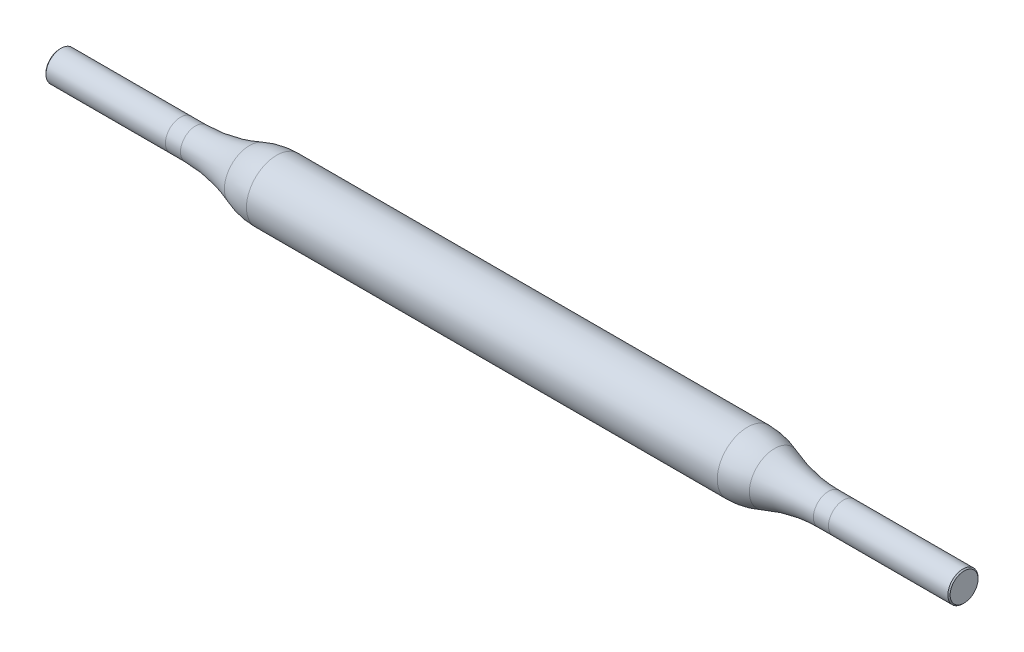
ISO-10303-21;
HEADER;
FILE_DESCRIPTION(('STEP AP214'),'2;1');
FILE_NAME('part.step','',(''),(''),'','','');
FILE_SCHEMA(('AUTOMOTIVE_DESIGN { 1 0 10303 214 1 1 1 1 }'));
ENDSEC;
DATA;
#1=APPLICATION_CONTEXT('core data for automotive mechanical design processes');
#2=APPLICATION_PROTOCOL_DEFINITION('international standard','automotive_design',2000,#1);
#3=PRODUCT_CONTEXT('',#1,'mechanical');
#4=PRODUCT('Part','Part','',(#3));
#5=PRODUCT_RELATED_PRODUCT_CATEGORY('part','',(#4));
#6=PRODUCT_DEFINITION_FORMATION('','',#4);
#7=PRODUCT_DEFINITION_CONTEXT('part definition',#1,'design');
#8=PRODUCT_DEFINITION('design','',#6,#7);
#9=PRODUCT_DEFINITION_SHAPE('','',#8);
#10=(LENGTH_UNIT() NAMED_UNIT(*) SI_UNIT(.MILLI.,.METRE.));
#11=(NAMED_UNIT(*) PLANE_ANGLE_UNIT() SI_UNIT($,.RADIAN.));
#12=(NAMED_UNIT(*) SI_UNIT($,.STERADIAN.) SOLID_ANGLE_UNIT());
#13=UNCERTAINTY_MEASURE_WITH_UNIT(LENGTH_MEASURE(1.E-05),#10,'distance_accuracy_value','');
#14=(GEOMETRIC_REPRESENTATION_CONTEXT(3) GLOBAL_UNCERTAINTY_ASSIGNED_CONTEXT((#13)) GLOBAL_UNIT_ASSIGNED_CONTEXT((#10,
#11,#12)) REPRESENTATION_CONTEXT('',''));
#15=CARTESIAN_POINT('',(0.,0.,0.));
#16=DIRECTION('',(0.,0.,1.));
#17=DIRECTION('',(1.,0.,0.));
#18=AXIS2_PLACEMENT_3D('',#15,#16,#17);
#19=CARTESIAN_POINT('',(-30.,0.,0.));
#20=DIRECTION('',(-1.,0.,0.));
#21=DIRECTION('',(0.,0.,1.));
#22=AXIS2_PLACEMENT_3D('',#19,#20,#21);
#23=CYLINDRICAL_SURFACE('',#22,1.);
#24=CARTESIAN_POINT('',(-29.925,0.,0.));
#25=DIRECTION('',(1.,0.,0.));
#26=DIRECTION('',(0.,0.,-1.));
#27=AXIS2_PLACEMENT_3D('',#24,#25,#26);
#28=CIRCLE('',#27,1.);
#29=CARTESIAN_POINT('',(-29.925,0.,-1.));
#30=VERTEX_POINT('',#29);
#31=EDGE_CURVE('E57',#30,#30,#28,.T.);
#32=ORIENTED_EDGE('',*,*,#31,.T.);
#33=EDGE_LOOP('',(#32));
#34=FACE_BOUND('',#33,.T.);
#35=CARTESIAN_POINT('',(-22.,0.,0.));
#36=DIRECTION('',(1.,0.,0.));
#37=DIRECTION('',(0.,0.,-1.));
#38=AXIS2_PLACEMENT_3D('',#35,#36,#37);
#39=CIRCLE('',#38,1.);
#40=CARTESIAN_POINT('',(-22.,0.,-1.));
#41=VERTEX_POINT('',#40);
#42=EDGE_CURVE('E66',#41,#41,#39,.T.);
#43=ORIENTED_EDGE('',*,*,#42,.F.);
#44=EDGE_LOOP('',(#43));
#45=FACE_BOUND('',#44,.T.);
#46=ADVANCED_FACE('F45',(#34,#45),#23,.T.);
#47=CARTESIAN_POINT('',(-30.,0.,0.));
#48=DIRECTION('',(-1.,0.,0.));
#49=DIRECTION('',(0.,0.,1.));
#50=AXIS2_PLACEMENT_3D('',#47,#48,#49);
#51=CYLINDRICAL_SURFACE('',#50,1.);
#52=CARTESIAN_POINT('',(21.,0.,0.));
#53=DIRECTION('',(-1.,0.,0.));
#54=DIRECTION('',(0.,0.,1.));
#55=AXIS2_PLACEMENT_3D('',#52,#53,#54);
#56=CIRCLE('',#55,0.999999999999999);
#57=CARTESIAN_POINT('',(21.,0.,0.99999999999999));
#58=VERTEX_POINT('',#57);
#59=EDGE_CURVE('E74',#58,#58,#56,.T.);
#60=ORIENTED_EDGE('',*,*,#59,.F.);
#61=EDGE_LOOP('',(#60));
#62=FACE_BOUND('',#61,.T.);
#63=CARTESIAN_POINT('',(22.,0.,0.));
#64=DIRECTION('',(1.,0.,0.));
#65=DIRECTION('',(0.,0.,-1.));
#66=AXIS2_PLACEMENT_3D('',#63,#64,#65);
#67=CIRCLE('',#66,1.);
#68=CARTESIAN_POINT('',(22.,0.,-1.00000000000001));
#69=VERTEX_POINT('',#68);
#70=EDGE_CURVE('E70',#69,#69,#67,.T.);
#71=ORIENTED_EDGE('',*,*,#70,.F.);
#72=EDGE_LOOP('',(#71));
#73=FACE_BOUND('',#72,.T.);
#74=ADVANCED_FACE('F126',(#62,#73),#51,.T.);
#75=CARTESIAN_POINT('',(-30.,0.,0.));
#76=DIRECTION('',(1.,0.,0.));
#77=DIRECTION('',(0.,0.,-1.));
#78=AXIS2_PLACEMENT_3D('',#75,#76,#77);
#79=PLANE('',#78);
#80=CARTESIAN_POINT('',(-30.,0.,0.));
#81=DIRECTION('',(1.,0.,0.));
#82=DIRECTION('',(0.,0.,-1.));
#83=AXIS2_PLACEMENT_3D('',#80,#81,#82);
#84=CIRCLE('',#83,0.925000000000016);
#85=CARTESIAN_POINT('',(-30.,0.,-0.925000000000016));
#86=VERTEX_POINT('',#85);
#87=EDGE_CURVE('E61',#86,#86,#84,.F.);
#88=ORIENTED_EDGE('',*,*,#87,.T.);
#89=EDGE_LOOP('',(#88));
#90=FACE_BOUND('',#89,.T.);
#91=ADVANCED_FACE('F129',(#90),#79,.F.);
#92=CARTESIAN_POINT('',(30.,0.,0.));
#93=DIRECTION('',(-1.,0.,0.));
#94=DIRECTION('',(0.,0.,1.));
#95=AXIS2_PLACEMENT_3D('',#92,#93,#94);
#96=PLANE('',#95);
#97=CARTESIAN_POINT('',(30.,0.,0.));
#98=DIRECTION('',(-1.,0.,0.));
#99=DIRECTION('',(0.,0.,1.));
#100=AXIS2_PLACEMENT_3D('',#97,#98,#99);
#101=CIRCLE('',#100,0.925000000000016);
#102=CARTESIAN_POINT('',(30.,0.,0.925000000000005));
#103=VERTEX_POINT('',#102);
#104=EDGE_CURVE('E10',#103,#103,#101,.F.);
#105=ORIENTED_EDGE('',*,*,#104,.T.);
#106=EDGE_LOOP('',(#105));
#107=FACE_BOUND('',#106,.T.);
#108=ADVANCED_FACE('F134',(#107),#96,.F.);
#109=CARTESIAN_POINT('',(29.925,0.,0.));
#110=DIRECTION('',(-1.,0.,0.));
#111=DIRECTION('',(0.,0.,1.));
#112=AXIS2_PLACEMENT_3D('',#109,#110,#111);
#113=CIRCLE('',#112,1.);
#114=CARTESIAN_POINT('',(29.925,0.,0.999999999999989));
#115=VERTEX_POINT('',#114);
#116=EDGE_CURVE('E53',#115,#115,#113,.T.);
#117=ORIENTED_EDGE('',*,*,#116,.T.);
#118=EDGE_LOOP('',(#117));
#119=FACE_BOUND('',#118,.T.);
#120=ORIENTED_EDGE('',*,*,#70,.T.);
#121=EDGE_LOOP('',(#120));
#122=FACE_BOUND('',#121,.T.);
#123=ADVANCED_FACE('F122',(#119,#122),#51,.T.);
#124=CARTESIAN_POINT('',(21.,0.,0.));
#125=DIRECTION('',(-1.,0.,0.));
#126=DIRECTION('',(0.,0.,1.));
#127=AXIS2_PLACEMENT_3D('',#124,#125,#126);
#128=TOROIDAL_SURFACE('',#127,10.9626996656551,9.96269966565513);
#129=CARTESIAN_POINT('',(17.4189798790619,0.,0.));
#130=DIRECTION('',(-1.,0.,0.));
#131=DIRECTION('',(0.,0.,1.));
#132=AXIS2_PLACEMENT_3D('',#129,#130,#131);
#133=CIRCLE('',#132,1.66583570400221);
#134=CARTESIAN_POINT('',(17.4189798790619,0.,1.6658357040022));
#135=VERTEX_POINT('',#134);
#136=EDGE_CURVE('E77',#135,#135,#133,.T.);
#137=ORIENTED_EDGE('',*,*,#136,.F.);
#138=EDGE_LOOP('',(#137));
#139=FACE_BOUND('',#138,.T.);
#140=ORIENTED_EDGE('',*,*,#59,.T.);
#141=EDGE_LOOP('',(#140));
#142=FACE_BOUND('',#141,.T.);
#143=ADVANCED_FACE('F116',(#139,#142),#128,.F.);
#144=CARTESIAN_POINT('',(15.6217661512993,0.,0.));
#145=DIRECTION('',(-1.,0.,0.));
#146=DIRECTION('',(0.,0.,1.));
#147=AXIS2_PLACEMENT_3D('',#144,#145,#146);
#148=DEGENERATE_TOROIDAL_SURFACE('',#147,3.00000000000001,5.,.F.);
#149=CARTESIAN_POINT('',(15.6217661512993,0.,0.));
#150=DIRECTION('',(-1.,0.,0.));
#151=DIRECTION('',(0.,0.,1.));
#152=AXIS2_PLACEMENT_3D('',#149,#150,#151);
#153=CIRCLE('',#152,1.99999999999999);
#154=CARTESIAN_POINT('',(15.6217661512993,0.,1.99999999999998));
#155=VERTEX_POINT('',#154);
#156=EDGE_CURVE('E80',#155,#155,#153,.T.);
#157=ORIENTED_EDGE('',*,*,#156,.F.);
#158=EDGE_LOOP('',(#157));
#159=FACE_BOUND('',#158,.T.);
#160=ORIENTED_EDGE('',*,*,#136,.T.);
#161=EDGE_LOOP('',(#160));
#162=FACE_BOUND('',#161,.T.);
#163=ADVANCED_FACE('F110',(#159,#162),#148,.F.);
#164=CARTESIAN_POINT('',(-30.,0.,0.));
#165=DIRECTION('',(-1.,0.,0.));
#166=DIRECTION('',(0.,0.,1.));
#167=AXIS2_PLACEMENT_3D('',#164,#165,#166);
#168=CYLINDRICAL_SURFACE('',#167,1.99999999999999);
#169=CARTESIAN_POINT('',(-15.6217661512993,0.,0.));
#170=DIRECTION('',(-1.,0.,0.));
#171=DIRECTION('',(0.,0.,1.));
#172=AXIS2_PLACEMENT_3D('',#169,#170,#171);
#173=CIRCLE('',#172,2.);
#174=CARTESIAN_POINT('',(-15.6217661512993,0.,1.99999999999999));
#175=VERTEX_POINT('',#174);
#176=EDGE_CURVE('E83',#175,#175,#173,.T.);
#177=ORIENTED_EDGE('',*,*,#176,.F.);
#178=EDGE_LOOP('',(#177));
#179=FACE_BOUND('',#178,.T.);
#180=ORIENTED_EDGE('',*,*,#156,.T.);
#181=EDGE_LOOP('',(#180));
#182=FACE_BOUND('',#181,.T.);
#183=ADVANCED_FACE('F104',(#179,#182),#168,.T.);
#184=CARTESIAN_POINT('',(-15.6217661512993,0.,0.));
#185=DIRECTION('',(-1.,0.,0.));
#186=DIRECTION('',(0.,0.,1.));
#187=AXIS2_PLACEMENT_3D('',#184,#185,#186);
#188=DEGENERATE_TOROIDAL_SURFACE('',#187,3.,5.,.F.);
#189=CARTESIAN_POINT('',(-17.4189798790618,0.,0.));
#190=DIRECTION('',(-1.,0.,0.));
#191=DIRECTION('',(0.,0.,1.));
#192=AXIS2_PLACEMENT_3D('',#189,#190,#191);
#193=CIRCLE('',#192,1.66583570400221);
#194=CARTESIAN_POINT('',(-17.4189798790618,0.,1.66583570400221));
#195=VERTEX_POINT('',#194);
#196=EDGE_CURVE('E86',#195,#195,#193,.T.);
#197=ORIENTED_EDGE('',*,*,#196,.F.);
#198=EDGE_LOOP('',(#197));
#199=FACE_BOUND('',#198,.T.);
#200=ORIENTED_EDGE('',*,*,#176,.T.);
#201=EDGE_LOOP('',(#200));
#202=FACE_BOUND('',#201,.T.);
#203=ADVANCED_FACE('F98',(#199,#202),#188,.F.);
#204=CARTESIAN_POINT('',(-21.,0.,0.));
#205=DIRECTION('',(-1.,0.,0.));
#206=DIRECTION('',(0.,0.,1.));
#207=AXIS2_PLACEMENT_3D('',#204,#205,#206);
#208=TOROIDAL_SURFACE('',#207,10.9626996656552,9.96269966565518);
#209=CARTESIAN_POINT('',(-21.,0.,0.));
#210=DIRECTION('',(-1.,0.,0.));
#211=DIRECTION('',(0.,0.,1.));
#212=AXIS2_PLACEMENT_3D('',#209,#210,#211);
#213=CIRCLE('',#212,0.999999999999999);
#214=CARTESIAN_POINT('',(-21.,0.,0.999999999999998));
#215=VERTEX_POINT('',#214);
#216=EDGE_CURVE('E89',#215,#215,#213,.T.);
#217=ORIENTED_EDGE('',*,*,#216,.F.);
#218=EDGE_LOOP('',(#217));
#219=FACE_BOUND('',#218,.T.);
#220=ORIENTED_EDGE('',*,*,#196,.T.);
#221=EDGE_LOOP('',(#220));
#222=FACE_BOUND('',#221,.T.);
#223=ADVANCED_FACE('F95',(#219,#222),#208,.F.);
#224=ORIENTED_EDGE('',*,*,#42,.T.);
#225=EDGE_LOOP('',(#224));
#226=FACE_BOUND('',#225,.T.);
#227=ORIENTED_EDGE('',*,*,#216,.T.);
#228=EDGE_LOOP('',(#227));
#229=FACE_BOUND('',#228,.T.);
#230=ADVANCED_FACE('F93',(#226,#229),#23,.T.);
#231=CARTESIAN_POINT('',(-30.,0.,0.));
#232=DIRECTION('',(1.,0.,0.));
#233=DIRECTION('',(0.,0.,-1.));
#234=AXIS2_PLACEMENT_3D('',#231,#232,#233);
#235=CONICAL_SURFACE('',#234,0.925000000000016,0.785398163397441);
#236=ORIENTED_EDGE('',*,*,#31,.F.);
#237=EDGE_LOOP('',(#236));
#238=FACE_BOUND('',#237,.T.);
#239=ORIENTED_EDGE('',*,*,#87,.F.);
#240=EDGE_LOOP('',(#239));
#241=FACE_BOUND('',#240,.T.);
#242=ADVANCED_FACE('F146',(#238,#241),#235,.T.);
#243=CARTESIAN_POINT('',(29.925,0.,0.));
#244=DIRECTION('',(-1.,0.,0.));
#245=DIRECTION('',(0.,0.,1.));
#246=AXIS2_PLACEMENT_3D('',#243,#244,#245);
#247=CONICAL_SURFACE('',#246,1.,0.785398163397442);
#248=ORIENTED_EDGE('',*,*,#104,.F.);
#249=EDGE_LOOP('',(#248));
#250=FACE_BOUND('',#249,.T.);
#251=ORIENTED_EDGE('',*,*,#116,.F.);
#252=EDGE_LOOP('',(#251));
#253=FACE_BOUND('',#252,.T.);
#254=ADVANCED_FACE('F48',(#250,#253),#247,.T.);
#255=CLOSED_SHELL('',(#46,#74,#91,#108,#123,#143,#163,#183,#203,#223,#230,#242,#254));
#256=MANIFOLD_SOLID_BREP('B2',#255);
#257=ADVANCED_BREP_SHAPE_REPRESENTATION('',(#18,#256),#14);
#258=SHAPE_DEFINITION_REPRESENTATION(#9,#257);
ENDSEC;
END-ISO-10303-21;
